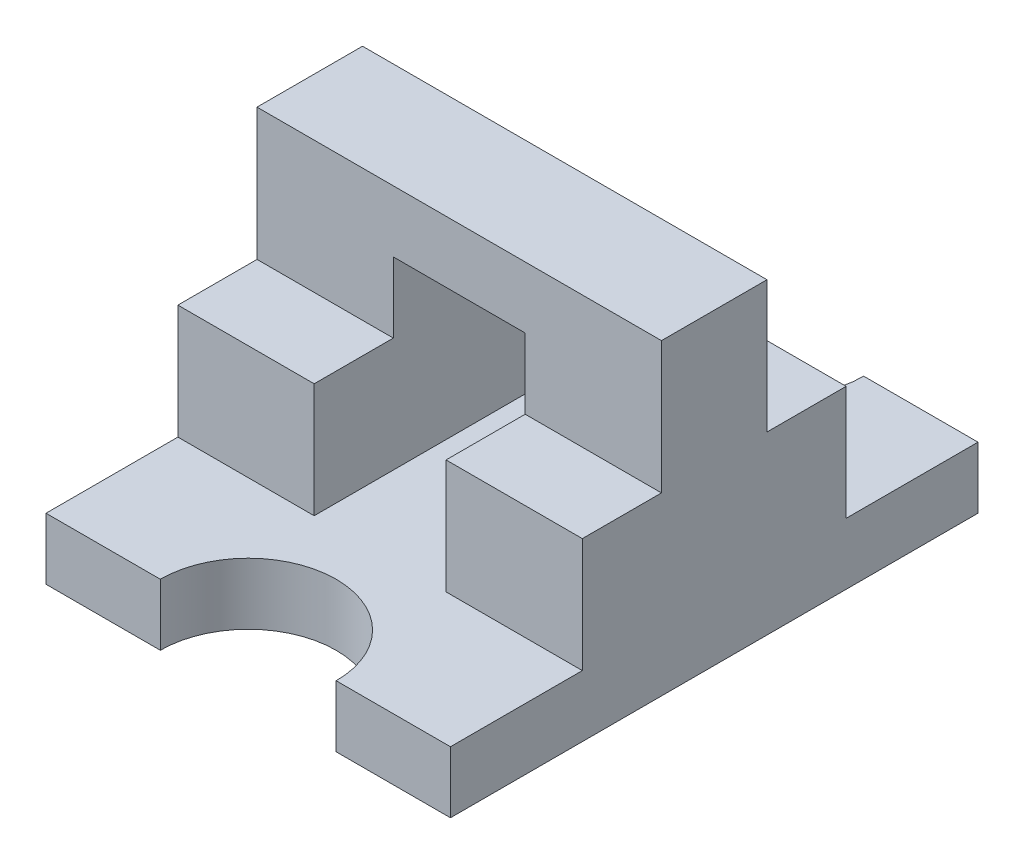
ISO-10303-21;
HEADER;
FILE_DESCRIPTION(('STEP AP214'),'2;1');
FILE_NAME('part.step','',(''),(''),'','','');
FILE_SCHEMA(('AUTOMOTIVE_DESIGN { 1 0 10303 214 1 1 1 1 }'));
ENDSEC;
DATA;
#1=APPLICATION_CONTEXT('core data for automotive mechanical design processes');
#2=APPLICATION_PROTOCOL_DEFINITION('international standard','automotive_design',2000,#1);
#3=PRODUCT_CONTEXT('',#1,'mechanical');
#4=PRODUCT('Part','Part','',(#3));
#5=PRODUCT_RELATED_PRODUCT_CATEGORY('part','',(#4));
#6=PRODUCT_DEFINITION_FORMATION('','',#4);
#7=PRODUCT_DEFINITION_CONTEXT('part definition',#1,'design');
#8=PRODUCT_DEFINITION('design','',#6,#7);
#9=PRODUCT_DEFINITION_SHAPE('','',#8);
#10=(LENGTH_UNIT() NAMED_UNIT(*) SI_UNIT(.MILLI.,.METRE.));
#11=(NAMED_UNIT(*) PLANE_ANGLE_UNIT() SI_UNIT($,.RADIAN.));
#12=(NAMED_UNIT(*) SI_UNIT($,.STERADIAN.) SOLID_ANGLE_UNIT());
#13=UNCERTAINTY_MEASURE_WITH_UNIT(LENGTH_MEASURE(1.E-05),#10,'distance_accuracy_value','');
#14=(GEOMETRIC_REPRESENTATION_CONTEXT(3) GLOBAL_UNCERTAINTY_ASSIGNED_CONTEXT((#13)) GLOBAL_UNIT_ASSIGNED_CONTEXT((#10,
#11,#12)) REPRESENTATION_CONTEXT('',''));
#15=CARTESIAN_POINT('',(0.,0.,0.));
#16=DIRECTION('',(0.,0.,1.));
#17=DIRECTION('',(1.,0.,0.));
#18=AXIS2_PLACEMENT_3D('',#15,#16,#17);
#19=CARTESIAN_POINT('',(46.,0.,-24.));
#20=DIRECTION('',(0.,0.,-1.));
#21=DIRECTION('',(0.,1.,0.));
#22=AXIS2_PLACEMENT_3D('',#19,#20,#21);
#23=PLANE('',#22);
#24=DIRECTION('',(0.,1.,0.));
#25=VECTOR('',#24,1.);
#26=CARTESIAN_POINT('',(30.5,0.,-24.));
#27=LINE('',#26,#25);
#28=CARTESIAN_POINT('',(30.5,20.,-24.));
#29=VERTEX_POINT('',#28);
#30=CARTESIAN_POINT('',(30.5,28.,-24.));
#31=VERTEX_POINT('',#30);
#32=EDGE_CURVE('E301',#29,#31,#27,.T.);
#33=ORIENTED_EDGE('',*,*,#32,.F.);
#34=DIRECTION('',(-1.,0.,0.));
#35=VECTOR('',#34,1.);
#36=CARTESIAN_POINT('',(46.,20.,-24.));
#37=LINE('',#36,#35);
#38=CARTESIAN_POINT('',(46.,20.,-24.));
#39=VERTEX_POINT('',#38);
#40=EDGE_CURVE('E271',#39,#29,#37,.T.);
#41=ORIENTED_EDGE('',*,*,#40,.F.);
#42=DIRECTION('',(0.,-1.,0.));
#43=VECTOR('',#42,1.);
#44=CARTESIAN_POINT('',(46.,0.,-24.));
#45=LINE('',#44,#43);
#46=CARTESIAN_POINT('',(46.,35.,-24.));
#47=VERTEX_POINT('',#46);
#48=EDGE_CURVE('E356',#47,#39,#45,.T.);
#49=ORIENTED_EDGE('',*,*,#48,.F.);
#50=DIRECTION('',(-1.,0.,0.));
#51=VECTOR('',#50,1.);
#52=CARTESIAN_POINT('',(46.,35.,-24.));
#53=LINE('',#52,#51);
#54=CARTESIAN_POINT('',(0.,35.,-24.));
#55=VERTEX_POINT('',#54);
#56=EDGE_CURVE('E394',#47,#55,#53,.T.);
#57=ORIENTED_EDGE('',*,*,#56,.T.);
#58=DIRECTION('',(0.,-1.,0.));
#59=VECTOR('',#58,1.);
#60=CARTESIAN_POINT('',(0.,0.,-24.));
#61=LINE('',#60,#59);
#62=CARTESIAN_POINT('',(0.,20.,-24.));
#63=VERTEX_POINT('',#62);
#64=EDGE_CURVE('E355',#55,#63,#61,.T.);
#65=ORIENTED_EDGE('',*,*,#64,.T.);
#66=CARTESIAN_POINT('',(15.5,20.,-24.));
#67=VERTEX_POINT('',#66);
#68=EDGE_CURVE('E270',#67,#63,#37,.T.);
#69=ORIENTED_EDGE('',*,*,#68,.F.);
#70=DIRECTION('',(0.,-1.,0.));
#71=VECTOR('',#70,1.);
#72=CARTESIAN_POINT('',(15.5,0.,-24.));
#73=LINE('',#72,#71);
#74=CARTESIAN_POINT('',(15.5,28.,-24.));
#75=VERTEX_POINT('',#74);
#76=EDGE_CURVE('E318',#75,#67,#73,.T.);
#77=ORIENTED_EDGE('',*,*,#76,.F.);
#78=DIRECTION('',(-1.,0.,0.));
#79=VECTOR('',#78,1.);
#80=CARTESIAN_POINT('',(46.,28.,-24.));
#81=LINE('',#80,#79);
#82=EDGE_CURVE('E309',#31,#75,#81,.T.);
#83=ORIENTED_EDGE('',*,*,#82,.F.);
#84=EDGE_LOOP('',(#33,#41,#49,#57,#65,#69,#77,#83));
#85=FACE_BOUND('',#84,.T.);
#86=ADVANCED_FACE('F45',(#85),#23,.F.);
#87=CARTESIAN_POINT('',(46.,20.,0.));
#88=DIRECTION('',(0.,-1.,0.));
#89=DIRECTION('',(0.,0.,-1.));
#90=AXIS2_PLACEMENT_3D('',#87,#88,#89);
#91=PLANE('',#90);
#92=DIRECTION('',(0.,0.,-1.));
#93=VECTOR('',#92,1.);
#94=CARTESIAN_POINT('',(30.5,20.,0.));
#95=LINE('',#94,#93);
#96=CARTESIAN_POINT('',(30.5,20.,-15.));
#97=VERTEX_POINT('',#96);
#98=EDGE_CURVE('E330',#97,#29,#95,.T.);
#99=ORIENTED_EDGE('',*,*,#98,.F.);
#100=DIRECTION('',(-1.,0.,0.));
#101=VECTOR('',#100,1.);
#102=CARTESIAN_POINT('',(46.,20.,-15.));
#103=LINE('',#102,#101);
#104=CARTESIAN_POINT('',(46.,20.,-15.));
#105=VERTEX_POINT('',#104);
#106=EDGE_CURVE('E266',#105,#97,#103,.T.);
#107=ORIENTED_EDGE('',*,*,#106,.F.);
#108=DIRECTION('',(0.,0.,1.));
#109=VECTOR('',#108,1.);
#110=CARTESIAN_POINT('',(46.,20.,0.));
#111=LINE('',#110,#109);
#112=EDGE_CURVE('E360',#39,#105,#111,.T.);
#113=ORIENTED_EDGE('',*,*,#112,.F.);
#114=ORIENTED_EDGE('',*,*,#40,.T.);
#115=EDGE_LOOP('',(#99,#107,#113,#114));
#116=FACE_BOUND('',#115,.T.);
#117=ADVANCED_FACE('F489',(#116),#91,.F.);
#118=DIRECTION('',(0.,0.,1.));
#119=VECTOR('',#118,1.);
#120=CARTESIAN_POINT('',(15.5,20.,0.));
#121=LINE('',#120,#119);
#122=CARTESIAN_POINT('',(15.5,20.,-15.));
#123=VERTEX_POINT('',#122);
#124=EDGE_CURVE('E60',#67,#123,#121,.T.);
#125=ORIENTED_EDGE('',*,*,#124,.F.);
#126=ORIENTED_EDGE('',*,*,#68,.T.);
#127=DIRECTION('',(0.,0.,1.));
#128=VECTOR('',#127,1.);
#129=CARTESIAN_POINT('',(0.,20.,0.));
#130=LINE('',#129,#128);
#131=CARTESIAN_POINT('',(0.,20.,-15.));
#132=VERTEX_POINT('',#131);
#133=EDGE_CURVE('E398',#63,#132,#130,.T.);
#134=ORIENTED_EDGE('',*,*,#133,.T.);
#135=EDGE_CURVE('E265',#123,#132,#103,.T.);
#136=ORIENTED_EDGE('',*,*,#135,.F.);
#137=EDGE_LOOP('',(#125,#126,#134,#136));
#138=FACE_BOUND('',#137,.T.);
#139=ADVANCED_FACE('F492',(#138),#91,.F.);
#140=CARTESIAN_POINT('',(46.,0.,-15.));
#141=DIRECTION('',(0.,0.,-1.));
#142=DIRECTION('',(-1.,0.,0.));
#143=AXIS2_PLACEMENT_3D('',#140,#141,#142);
#144=PLANE('',#143);
#145=DIRECTION('',(0.,1.,0.));
#146=VECTOR('',#145,1.);
#147=CARTESIAN_POINT('',(30.5,0.,-15.));
#148=LINE('',#147,#146);
#149=CARTESIAN_POINT('',(30.5,7.,-15.));
#150=VERTEX_POINT('',#149);
#151=EDGE_CURVE('E327',#150,#97,#148,.T.);
#152=ORIENTED_EDGE('',*,*,#151,.F.);
#153=DIRECTION('',(-1.,0.,0.));
#154=VECTOR('',#153,1.);
#155=CARTESIAN_POINT('',(46.,7.,-15.));
#156=LINE('',#155,#154);
#157=CARTESIAN_POINT('',(46.,7.,-15.));
#158=VERTEX_POINT('',#157);
#159=EDGE_CURVE('E261',#158,#150,#156,.T.);
#160=ORIENTED_EDGE('',*,*,#159,.F.);
#161=DIRECTION('',(0.,-1.,0.));
#162=VECTOR('',#161,1.);
#163=CARTESIAN_POINT('',(46.,0.,-15.));
#164=LINE('',#163,#162);
#165=EDGE_CURVE('E364',#105,#158,#164,.T.);
#166=ORIENTED_EDGE('',*,*,#165,.F.);
#167=ORIENTED_EDGE('',*,*,#106,.T.);
#168=EDGE_LOOP('',(#152,#160,#166,#167));
#169=FACE_BOUND('',#168,.T.);
#170=ADVANCED_FACE('F486',(#169),#144,.F.);
#171=DIRECTION('',(0.,-1.,0.));
#172=VECTOR('',#171,1.);
#173=CARTESIAN_POINT('',(15.5,0.,-15.));
#174=LINE('',#173,#172);
#175=CARTESIAN_POINT('',(15.5,7.,-15.));
#176=VERTEX_POINT('',#175);
#177=EDGE_CURVE('E208',#123,#176,#174,.T.);
#178=ORIENTED_EDGE('',*,*,#177,.F.);
#179=ORIENTED_EDGE('',*,*,#135,.T.);
#180=DIRECTION('',(0.,-1.,0.));
#181=VECTOR('',#180,1.);
#182=CARTESIAN_POINT('',(0.,0.,-15.));
#183=LINE('',#182,#181);
#184=CARTESIAN_POINT('',(0.,7.,-15.));
#185=VERTEX_POINT('',#184);
#186=EDGE_CURVE('E402',#132,#185,#183,.T.);
#187=ORIENTED_EDGE('',*,*,#186,.T.);
#188=EDGE_CURVE('E260',#176,#185,#156,.T.);
#189=ORIENTED_EDGE('',*,*,#188,.F.);
#190=EDGE_LOOP('',(#178,#179,#187,#189));
#191=FACE_BOUND('',#190,.T.);
#192=ADVANCED_FACE('F521',(#191),#144,.F.);
#193=CARTESIAN_POINT('',(46.,0.,-45.));
#194=DIRECTION('',(0.,0.,1.));
#195=DIRECTION('',(1.,0.,0.));
#196=AXIS2_PLACEMENT_3D('',#193,#194,#195);
#197=PLANE('',#196);
#198=DIRECTION('',(0.,-1.,0.));
#199=VECTOR('',#198,1.);
#200=CARTESIAN_POINT('',(30.5,0.,-45.));
#201=LINE('',#200,#199);
#202=CARTESIAN_POINT('',(30.5,20.,-45.));
#203=VERTEX_POINT('',#202);
#204=CARTESIAN_POINT('',(30.5,7.,-45.));
#205=VERTEX_POINT('',#204);
#206=EDGE_CURVE('E324',#203,#205,#201,.T.);
#207=ORIENTED_EDGE('',*,*,#206,.F.);
#208=DIRECTION('',(-1.,0.,0.));
#209=VECTOR('',#208,1.);
#210=CARTESIAN_POINT('',(46.,20.,-45.));
#211=LINE('',#210,#209);
#212=CARTESIAN_POINT('',(46.,20.,-45.));
#213=VERTEX_POINT('',#212);
#214=EDGE_CURVE('E232',#213,#203,#211,.T.);
#215=ORIENTED_EDGE('',*,*,#214,.F.);
#216=DIRECTION('',(0.,1.,0.));
#217=VECTOR('',#216,1.);
#218=CARTESIAN_POINT('',(46.,0.,-45.));
#219=LINE('',#218,#217);
#220=CARTESIAN_POINT('',(46.,7.,-45.));
#221=VERTEX_POINT('',#220);
#222=EDGE_CURVE('E382',#221,#213,#219,.T.);
#223=ORIENTED_EDGE('',*,*,#222,.F.);
#224=DIRECTION('',(-1.,0.,0.));
#225=VECTOR('',#224,1.);
#226=CARTESIAN_POINT('',(46.,7.,-45.));
#227=LINE('',#226,#225);
#228=EDGE_CURVE('E231',#221,#205,#227,.T.);
#229=ORIENTED_EDGE('',*,*,#228,.T.);
#230=EDGE_LOOP('',(#207,#215,#223,#229));
#231=FACE_BOUND('',#230,.T.);
#232=ADVANCED_FACE('F478',(#231),#197,.F.);
#233=DIRECTION('',(0.,1.,0.));
#234=VECTOR('',#233,1.);
#235=CARTESIAN_POINT('',(15.5,0.,-45.));
#236=LINE('',#235,#234);
#237=CARTESIAN_POINT('',(15.5,7.,-45.));
#238=VERTEX_POINT('',#237);
#239=CARTESIAN_POINT('',(15.5,20.,-45.));
#240=VERTEX_POINT('',#239);
#241=EDGE_CURVE('E206',#238,#240,#236,.T.);
#242=ORIENTED_EDGE('',*,*,#241,.F.);
#243=CARTESIAN_POINT('',(0.,7.,-45.));
#244=VERTEX_POINT('',#243);
#245=EDGE_CURVE('E219',#238,#244,#227,.T.);
#246=ORIENTED_EDGE('',*,*,#245,.T.);
#247=DIRECTION('',(0.,1.,0.));
#248=VECTOR('',#247,1.);
#249=CARTESIAN_POINT('',(0.,0.,-45.));
#250=LINE('',#249,#248);
#251=CARTESIAN_POINT('',(0.,20.,-45.));
#252=VERTEX_POINT('',#251);
#253=EDGE_CURVE('E424',#244,#252,#250,.T.);
#254=ORIENTED_EDGE('',*,*,#253,.T.);
#255=EDGE_CURVE('E221',#240,#252,#211,.T.);
#256=ORIENTED_EDGE('',*,*,#255,.F.);
#257=EDGE_LOOP('',(#242,#246,#254,#256));
#258=FACE_BOUND('',#257,.T.);
#259=ADVANCED_FACE('F217',(#258),#197,.F.);
#260=CARTESIAN_POINT('',(46.,20.,0.));
#261=DIRECTION('',(0.,-1.,0.));
#262=DIRECTION('',(0.,0.,-1.));
#263=AXIS2_PLACEMENT_3D('',#260,#261,#262);
#264=PLANE('',#263);
#265=DIRECTION('',(0.,0.,-1.));
#266=VECTOR('',#265,1.);
#267=CARTESIAN_POINT('',(30.5,20.,0.));
#268=LINE('',#267,#266);
#269=CARTESIAN_POINT('',(30.5,20.,-36.));
#270=VERTEX_POINT('',#269);
#271=EDGE_CURVE('E321',#270,#203,#268,.T.);
#272=ORIENTED_EDGE('',*,*,#271,.F.);
#273=DIRECTION('',(-1.,0.,0.));
#274=VECTOR('',#273,1.);
#275=CARTESIAN_POINT('',(46.,20.,-36.));
#276=LINE('',#275,#274);
#277=CARTESIAN_POINT('',(46.,20.,-36.));
#278=VERTEX_POINT('',#277);
#279=EDGE_CURVE('E443',#278,#270,#276,.T.);
#280=ORIENTED_EDGE('',*,*,#279,.F.);
#281=DIRECTION('',(0.,0.,1.));
#282=VECTOR('',#281,1.);
#283=CARTESIAN_POINT('',(46.,20.,0.));
#284=LINE('',#283,#282);
#285=EDGE_CURVE('E385',#213,#278,#284,.T.);
#286=ORIENTED_EDGE('',*,*,#285,.F.);
#287=ORIENTED_EDGE('',*,*,#214,.T.);
#288=EDGE_LOOP('',(#272,#280,#286,#287));
#289=FACE_BOUND('',#288,.T.);
#290=ADVANCED_FACE('F474',(#289),#264,.F.);
#291=DIRECTION('',(0.,0.,1.));
#292=VECTOR('',#291,1.);
#293=CARTESIAN_POINT('',(15.5,20.,0.));
#294=LINE('',#293,#292);
#295=CARTESIAN_POINT('',(15.5,20.,-36.));
#296=VERTEX_POINT('',#295);
#297=EDGE_CURVE('E223',#240,#296,#294,.T.);
#298=ORIENTED_EDGE('',*,*,#297,.F.);
#299=ORIENTED_EDGE('',*,*,#255,.T.);
#300=DIRECTION('',(0.,0.,1.));
#301=VECTOR('',#300,1.);
#302=CARTESIAN_POINT('',(0.,20.,0.));
#303=LINE('',#302,#301);
#304=CARTESIAN_POINT('',(0.,20.,-36.));
#305=VERTEX_POINT('',#304);
#306=EDGE_CURVE('E427',#252,#305,#303,.T.);
#307=ORIENTED_EDGE('',*,*,#306,.T.);
#308=EDGE_CURVE('E442',#296,#305,#276,.T.);
#309=ORIENTED_EDGE('',*,*,#308,.F.);
#310=EDGE_LOOP('',(#298,#299,#307,#309));
#311=FACE_BOUND('',#310,.T.);
#312=ADVANCED_FACE('F453',(#311),#264,.F.);
#313=CARTESIAN_POINT('',(46.,0.,-36.));
#314=DIRECTION('',(0.,0.,1.));
#315=DIRECTION('',(1.,0.,0.));
#316=AXIS2_PLACEMENT_3D('',#313,#314,#315);
#317=PLANE('',#316);
#318=DIRECTION('',(0.,-1.,0.));
#319=VECTOR('',#318,1.);
#320=CARTESIAN_POINT('',(30.5,0.,-36.));
#321=LINE('',#320,#319);
#322=CARTESIAN_POINT('',(30.5,28.,-36.));
#323=VERTEX_POINT('',#322);
#324=EDGE_CURVE('E11',#323,#270,#321,.T.);
#325=ORIENTED_EDGE('',*,*,#324,.F.);
#326=DIRECTION('',(1.,0.,0.));
#327=VECTOR('',#326,1.);
#328=CARTESIAN_POINT('',(46.,28.,-36.));
#329=LINE('',#328,#327);
#330=CARTESIAN_POINT('',(15.5,28.,-36.));
#331=VERTEX_POINT('',#330);
#332=EDGE_CURVE('E281',#331,#323,#329,.T.);
#333=ORIENTED_EDGE('',*,*,#332,.F.);
#334=DIRECTION('',(0.,1.,0.));
#335=VECTOR('',#334,1.);
#336=CARTESIAN_POINT('',(15.5,0.,-36.));
#337=LINE('',#336,#335);
#338=EDGE_CURVE('E53',#296,#331,#337,.T.);
#339=ORIENTED_EDGE('',*,*,#338,.F.);
#340=ORIENTED_EDGE('',*,*,#308,.T.);
#341=DIRECTION('',(0.,1.,0.));
#342=VECTOR('',#341,1.);
#343=CARTESIAN_POINT('',(0.,0.,-36.));
#344=LINE('',#343,#342);
#345=CARTESIAN_POINT('',(0.,35.,-36.));
#346=VERTEX_POINT('',#345);
#347=EDGE_CURVE('E431',#305,#346,#344,.T.);
#348=ORIENTED_EDGE('',*,*,#347,.T.);
#349=DIRECTION('',(-1.,0.,0.));
#350=VECTOR('',#349,1.);
#351=CARTESIAN_POINT('',(46.,35.,-36.));
#352=LINE('',#351,#350);
#353=CARTESIAN_POINT('',(46.,35.,-36.));
#354=VERTEX_POINT('',#353);
#355=EDGE_CURVE('E439',#354,#346,#352,.T.);
#356=ORIENTED_EDGE('',*,*,#355,.F.);
#357=DIRECTION('',(0.,1.,0.));
#358=VECTOR('',#357,1.);
#359=CARTESIAN_POINT('',(46.,0.,-36.));
#360=LINE('',#359,#358);
#361=EDGE_CURVE('E388',#278,#354,#360,.T.);
#362=ORIENTED_EDGE('',*,*,#361,.F.);
#363=ORIENTED_EDGE('',*,*,#279,.T.);
#364=EDGE_LOOP('',(#325,#333,#339,#340,#348,#356,#362,#363));
#365=FACE_BOUND('',#364,.T.);
#366=ADVANCED_FACE('F290',(#365),#317,.F.);
#367=CARTESIAN_POINT('',(46.,0.,0.));
#368=DIRECTION('',(0.,0.,-1.));
#369=DIRECTION('',(0.,1.,0.));
#370=AXIS2_PLACEMENT_3D('',#367,#368,#369);
#371=PLANE('',#370);
#372=DIRECTION('',(0.,-1.,0.));
#373=VECTOR('',#372,1.);
#374=CARTESIAN_POINT('',(33.,46.,0.));
#375=LINE('',#374,#373);
#376=CARTESIAN_POINT('',(33.,7.,0.));
#377=VERTEX_POINT('',#376);
#378=CARTESIAN_POINT('',(33.,0.,0.));
#379=VERTEX_POINT('',#378);
#380=EDGE_CURVE('E339',#377,#379,#375,.T.);
#381=ORIENTED_EDGE('',*,*,#380,.T.);
#382=DIRECTION('',(-1.,0.,0.));
#383=VECTOR('',#382,1.);
#384=CARTESIAN_POINT('',(46.,0.,0.));
#385=LINE('',#384,#383);
#386=CARTESIAN_POINT('',(46.,0.,0.));
#387=VERTEX_POINT('',#386);
#388=EDGE_CURVE('E251',#387,#379,#385,.T.);
#389=ORIENTED_EDGE('',*,*,#388,.F.);
#390=DIRECTION('',(0.,-1.,0.));
#391=VECTOR('',#390,1.);
#392=CARTESIAN_POINT('',(46.,0.,0.));
#393=LINE('',#392,#391);
#394=CARTESIAN_POINT('',(46.,7.,0.));
#395=VERTEX_POINT('',#394);
#396=EDGE_CURVE('E370',#395,#387,#393,.T.);
#397=ORIENTED_EDGE('',*,*,#396,.F.);
#398=DIRECTION('',(-1.,0.,0.));
#399=VECTOR('',#398,1.);
#400=CARTESIAN_POINT('',(46.,7.,0.));
#401=LINE('',#400,#399);
#402=EDGE_CURVE('E256',#395,#377,#401,.T.);
#403=ORIENTED_EDGE('',*,*,#402,.T.);
#404=EDGE_LOOP('',(#381,#389,#397,#403));
#405=FACE_BOUND('',#404,.T.);
#406=ADVANCED_FACE('F584',(#405),#371,.F.);
#407=DIRECTION('',(0.,-1.,0.));
#408=VECTOR('',#407,1.);
#409=CARTESIAN_POINT('',(13.,46.,0.));
#410=LINE('',#409,#408);
#411=CARTESIAN_POINT('',(13.,7.,0.));
#412=VERTEX_POINT('',#411);
#413=CARTESIAN_POINT('',(13.,0.,0.));
#414=VERTEX_POINT('',#413);
#415=EDGE_CURVE('E336',#412,#414,#410,.T.);
#416=ORIENTED_EDGE('',*,*,#415,.F.);
#417=CARTESIAN_POINT('',(0.,7.,0.));
#418=VERTEX_POINT('',#417);
#419=EDGE_CURVE('E255',#412,#418,#401,.T.);
#420=ORIENTED_EDGE('',*,*,#419,.T.);
#421=DIRECTION('',(0.,-1.,0.));
#422=VECTOR('',#421,1.);
#423=CARTESIAN_POINT('',(0.,0.,0.));
#424=LINE('',#423,#422);
#425=CARTESIAN_POINT('',(0.,0.,0.));
#426=VERTEX_POINT('',#425);
#427=EDGE_CURVE('E410',#418,#426,#424,.T.);
#428=ORIENTED_EDGE('',*,*,#427,.T.);
#429=EDGE_CURVE('E250',#414,#426,#385,.T.);
#430=ORIENTED_EDGE('',*,*,#429,.F.);
#431=EDGE_LOOP('',(#416,#420,#428,#430));
#432=FACE_BOUND('',#431,.T.);
#433=ADVANCED_FACE('F518',(#432),#371,.F.);
#434=CARTESIAN_POINT('',(46.,0.,-60.));
#435=DIRECTION('',(0.,0.,1.));
#436=DIRECTION('',(1.,0.,0.));
#437=AXIS2_PLACEMENT_3D('',#434,#435,#436);
#438=PLANE('',#437);
#439=DIRECTION('',(0.,-1.,0.));
#440=VECTOR('',#439,1.);
#441=CARTESIAN_POINT('',(13.,46.,-60.));
#442=LINE('',#441,#440);
#443=CARTESIAN_POINT('',(13.,7.00000000000001,-60.));
#444=VERTEX_POINT('',#443);
#445=CARTESIAN_POINT('',(13.,0.,-60.));
#446=VERTEX_POINT('',#445);
#447=EDGE_CURVE('E340',#444,#446,#442,.T.);
#448=ORIENTED_EDGE('',*,*,#447,.T.);
#449=DIRECTION('',(-1.,0.,0.));
#450=VECTOR('',#449,1.);
#451=CARTESIAN_POINT('',(46.,0.,-60.));
#452=LINE('',#451,#450);
#453=CARTESIAN_POINT('',(0.,0.,-60.));
#454=VERTEX_POINT('',#453);
#455=EDGE_CURVE('E245',#446,#454,#452,.T.);
#456=ORIENTED_EDGE('',*,*,#455,.T.);
#457=DIRECTION('',(0.,1.,0.));
#458=VECTOR('',#457,1.);
#459=CARTESIAN_POINT('',(0.,0.,-60.));
#460=LINE('',#459,#458);
#461=CARTESIAN_POINT('',(0.,7.,-60.));
#462=VERTEX_POINT('',#461);
#463=EDGE_CURVE('E418',#454,#462,#460,.T.);
#464=ORIENTED_EDGE('',*,*,#463,.T.);
#465=DIRECTION('',(-1.,0.,0.));
#466=VECTOR('',#465,1.);
#467=CARTESIAN_POINT('',(46.,7.,-60.));
#468=LINE('',#467,#466);
#469=EDGE_CURVE('E237',#444,#462,#468,.T.);
#470=ORIENTED_EDGE('',*,*,#469,.F.);
#471=EDGE_LOOP('',(#448,#456,#464,#470));
#472=FACE_BOUND('',#471,.T.);
#473=ADVANCED_FACE('F506',(#472),#438,.F.);
#474=DIRECTION('',(0.,-1.,0.));
#475=VECTOR('',#474,1.);
#476=CARTESIAN_POINT('',(33.,46.,-60.));
#477=LINE('',#476,#475);
#478=CARTESIAN_POINT('',(33.,7.00000000000001,-60.));
#479=VERTEX_POINT('',#478);
#480=CARTESIAN_POINT('',(33.,0.,-60.));
#481=VERTEX_POINT('',#480);
#482=EDGE_CURVE('E335',#479,#481,#477,.T.);
#483=ORIENTED_EDGE('',*,*,#482,.F.);
#484=CARTESIAN_POINT('',(46.,7.,-60.));
#485=VERTEX_POINT('',#484);
#486=EDGE_CURVE('E242',#485,#479,#468,.T.);
#487=ORIENTED_EDGE('',*,*,#486,.F.);
#488=DIRECTION('',(0.,1.,0.));
#489=VECTOR('',#488,1.);
#490=CARTESIAN_POINT('',(46.,0.,-60.));
#491=LINE('',#490,#489);
#492=CARTESIAN_POINT('',(46.,0.,-60.));
#493=VERTEX_POINT('',#492);
#494=EDGE_CURVE('E376',#493,#485,#491,.T.);
#495=ORIENTED_EDGE('',*,*,#494,.F.);
#496=EDGE_CURVE('E246',#493,#481,#452,.T.);
#497=ORIENTED_EDGE('',*,*,#496,.T.);
#498=EDGE_LOOP('',(#483,#487,#495,#497));
#499=FACE_BOUND('',#498,.T.);
#500=ADVANCED_FACE('F688',(#499),#438,.F.);
#501=CARTESIAN_POINT('',(46.,0.,0.));
#502=DIRECTION('',(0.,1.,0.));
#503=DIRECTION('',(0.,0.,1.));
#504=AXIS2_PLACEMENT_3D('',#501,#502,#503);
#505=PLANE('',#504);
#506=CARTESIAN_POINT('',(23.,0.,0.));
#507=DIRECTION('',(0.,1.,0.));
#508=DIRECTION('',(0.,0.,1.));
#509=AXIS2_PLACEMENT_3D('',#506,#507,#508);
#510=CIRCLE('',#509,10.);
#511=EDGE_CURVE('E278',#414,#379,#510,.F.);
#512=ORIENTED_EDGE('',*,*,#511,.F.);
#513=ORIENTED_EDGE('',*,*,#429,.T.);
#514=DIRECTION('',(0.,0.,-1.));
#515=VECTOR('',#514,1.);
#516=CARTESIAN_POINT('',(0.,0.,0.));
#517=LINE('',#516,#515);
#518=EDGE_CURVE('E414',#426,#454,#517,.T.);
#519=ORIENTED_EDGE('',*,*,#518,.T.);
#520=ORIENTED_EDGE('',*,*,#455,.F.);
#521=CARTESIAN_POINT('',(23.,0.,-60.));
#522=DIRECTION('',(0.,1.,0.));
#523=DIRECTION('',(0.,0.,1.));
#524=AXIS2_PLACEMENT_3D('',#521,#522,#523);
#525=CIRCLE('',#524,10.);
#526=EDGE_CURVE('E344',#481,#446,#525,.F.);
#527=ORIENTED_EDGE('',*,*,#526,.F.);
#528=ORIENTED_EDGE('',*,*,#496,.F.);
#529=DIRECTION('',(0.,0.,-1.));
#530=VECTOR('',#529,1.);
#531=CARTESIAN_POINT('',(46.,0.,0.));
#532=LINE('',#531,#530);
#533=EDGE_CURVE('E373',#387,#493,#532,.T.);
#534=ORIENTED_EDGE('',*,*,#533,.F.);
#535=ORIENTED_EDGE('',*,*,#388,.T.);
#536=EDGE_LOOP('',(#512,#513,#519,#520,#527,#528,#534,#535));
#537=FACE_BOUND('',#536,.T.);
#538=ADVANCED_FACE('F513',(#537),#505,.F.);
#539=CARTESIAN_POINT('',(46.,6.99999999999999,0.));
#540=DIRECTION('',(0.,-1.,0.));
#541=DIRECTION('',(0.,0.,-1.));
#542=AXIS2_PLACEMENT_3D('',#539,#540,#541);
#543=PLANE('',#542);
#544=ORIENTED_EDGE('',*,*,#486,.T.);
#545=CARTESIAN_POINT('',(23.,7.00000000000001,-60.));
#546=DIRECTION('',(0.,-1.,0.));
#547=DIRECTION('',(0.,0.,-1.));
#548=AXIS2_PLACEMENT_3D('',#545,#546,#547);
#549=CIRCLE('',#548,10.);
#550=EDGE_CURVE('E275',#444,#479,#549,.F.);
#551=ORIENTED_EDGE('',*,*,#550,.F.);
#552=ORIENTED_EDGE('',*,*,#469,.T.);
#553=DIRECTION('',(0.,0.,1.));
#554=VECTOR('',#553,1.);
#555=CARTESIAN_POINT('',(0.,6.99999999999999,0.));
#556=LINE('',#555,#554);
#557=EDGE_CURVE('E228',#462,#244,#556,.T.);
#558=ORIENTED_EDGE('',*,*,#557,.T.);
#559=ORIENTED_EDGE('',*,*,#245,.F.);
#560=DIRECTION('',(0.,0.,1.));
#561=VECTOR('',#560,1.);
#562=CARTESIAN_POINT('',(15.5,7.,-60.));
#563=LINE('',#562,#561);
#564=EDGE_CURVE('E203',#238,#176,#563,.T.);
#565=ORIENTED_EDGE('',*,*,#564,.T.);
#566=ORIENTED_EDGE('',*,*,#188,.T.);
#567=DIRECTION('',(0.,0.,1.));
#568=VECTOR('',#567,1.);
#569=CARTESIAN_POINT('',(0.,7.,0.));
#570=LINE('',#569,#568);
#571=EDGE_CURVE('E406',#185,#418,#570,.T.);
#572=ORIENTED_EDGE('',*,*,#571,.T.);
#573=ORIENTED_EDGE('',*,*,#419,.F.);
#574=CARTESIAN_POINT('',(23.,7.,0.));
#575=DIRECTION('',(0.,-1.,0.));
#576=DIRECTION('',(0.,0.,-1.));
#577=AXIS2_PLACEMENT_3D('',#574,#575,#576);
#578=CIRCLE('',#577,10.);
#579=EDGE_CURVE('E352',#377,#412,#578,.F.);
#580=ORIENTED_EDGE('',*,*,#579,.F.);
#581=ORIENTED_EDGE('',*,*,#402,.F.);
#582=DIRECTION('',(0.,0.,1.));
#583=VECTOR('',#582,1.);
#584=CARTESIAN_POINT('',(46.,7.,0.));
#585=LINE('',#584,#583);
#586=EDGE_CURVE('E367',#158,#395,#585,.T.);
#587=ORIENTED_EDGE('',*,*,#586,.F.);
#588=ORIENTED_EDGE('',*,*,#159,.T.);
#589=DIRECTION('',(0.,0.,1.));
#590=VECTOR('',#589,1.);
#591=CARTESIAN_POINT('',(30.5,7.,-60.));
#592=LINE('',#591,#590);
#593=EDGE_CURVE('E213',#205,#150,#592,.T.);
#594=ORIENTED_EDGE('',*,*,#593,.F.);
#595=ORIENTED_EDGE('',*,*,#228,.F.);
#596=DIRECTION('',(0.,0.,1.));
#597=VECTOR('',#596,1.);
#598=CARTESIAN_POINT('',(46.,6.99999999999999,0.));
#599=LINE('',#598,#597);
#600=EDGE_CURVE('E379',#485,#221,#599,.T.);
#601=ORIENTED_EDGE('',*,*,#600,.F.);
#602=EDGE_LOOP('',(#544,#551,#552,#558,#559,#565,#566,#572,#573,#580,#581,#587,#588,#594,#595,#601));
#603=FACE_BOUND('',#602,.T.);
#604=ADVANCED_FACE('F226',(#603),#543,.F.);
#605=CARTESIAN_POINT('',(46.,35.,0.));
#606=DIRECTION('',(0.,-1.,0.));
#607=DIRECTION('',(0.,0.,-1.));
#608=AXIS2_PLACEMENT_3D('',#605,#606,#607);
#609=PLANE('',#608);
#610=DIRECTION('',(0.,0.,1.));
#611=VECTOR('',#610,1.);
#612=CARTESIAN_POINT('',(0.,35.,0.));
#613=LINE('',#612,#611);
#614=EDGE_CURVE('E361',#346,#55,#613,.T.);
#615=ORIENTED_EDGE('',*,*,#614,.T.);
#616=ORIENTED_EDGE('',*,*,#56,.F.);
#617=DIRECTION('',(0.,0.,1.));
#618=VECTOR('',#617,1.);
#619=CARTESIAN_POINT('',(46.,35.,0.));
#620=LINE('',#619,#618);
#621=EDGE_CURVE('E391',#354,#47,#620,.T.);
#622=ORIENTED_EDGE('',*,*,#621,.F.);
#623=ORIENTED_EDGE('',*,*,#355,.T.);
#624=EDGE_LOOP('',(#615,#616,#622,#623));
#625=FACE_BOUND('',#624,.T.);
#626=ADVANCED_FACE('F461',(#625),#609,.F.);
#627=CARTESIAN_POINT('',(46.,0.,0.));
#628=DIRECTION('',(1.,0.,0.));
#629=DIRECTION('',(0.,0.,-1.));
#630=AXIS2_PLACEMENT_3D('',#627,#628,#629);
#631=PLANE('',#630);
#632=ORIENTED_EDGE('',*,*,#48,.T.);
#633=ORIENTED_EDGE('',*,*,#112,.T.);
#634=ORIENTED_EDGE('',*,*,#165,.T.);
#635=ORIENTED_EDGE('',*,*,#586,.T.);
#636=ORIENTED_EDGE('',*,*,#396,.T.);
#637=ORIENTED_EDGE('',*,*,#533,.T.);
#638=ORIENTED_EDGE('',*,*,#494,.T.);
#639=ORIENTED_EDGE('',*,*,#600,.T.);
#640=ORIENTED_EDGE('',*,*,#222,.T.);
#641=ORIENTED_EDGE('',*,*,#285,.T.);
#642=ORIENTED_EDGE('',*,*,#361,.T.);
#643=ORIENTED_EDGE('',*,*,#621,.T.);
#644=EDGE_LOOP('',(#632,#633,#634,#635,#636,#637,#638,#639,#640,#641,#642,#643));
#645=FACE_BOUND('',#644,.T.);
#646=ADVANCED_FACE('F468',(#645),#631,.T.);
#647=CARTESIAN_POINT('',(0.,0.,0.));
#648=DIRECTION('',(1.,0.,0.));
#649=DIRECTION('',(0.,0.,-1.));
#650=AXIS2_PLACEMENT_3D('',#647,#648,#649);
#651=PLANE('',#650);
#652=ORIENTED_EDGE('',*,*,#64,.F.);
#653=ORIENTED_EDGE('',*,*,#614,.F.);
#654=ORIENTED_EDGE('',*,*,#347,.F.);
#655=ORIENTED_EDGE('',*,*,#306,.F.);
#656=ORIENTED_EDGE('',*,*,#253,.F.);
#657=ORIENTED_EDGE('',*,*,#557,.F.);
#658=ORIENTED_EDGE('',*,*,#463,.F.);
#659=ORIENTED_EDGE('',*,*,#518,.F.);
#660=ORIENTED_EDGE('',*,*,#427,.F.);
#661=ORIENTED_EDGE('',*,*,#571,.F.);
#662=ORIENTED_EDGE('',*,*,#186,.F.);
#663=ORIENTED_EDGE('',*,*,#133,.F.);
#664=EDGE_LOOP('',(#652,#653,#654,#655,#656,#657,#658,#659,#660,#661,#662,#663));
#665=FACE_BOUND('',#664,.T.);
#666=ADVANCED_FACE('F457',(#665),#651,.F.);
#667=CARTESIAN_POINT('',(23.,46.,-60.));
#668=DIRECTION('',(0.,-1.,0.));
#669=DIRECTION('',(0.,0.,-1.));
#670=AXIS2_PLACEMENT_3D('',#667,#668,#669);
#671=CYLINDRICAL_SURFACE('',#670,10.);
#672=ORIENTED_EDGE('',*,*,#526,.T.);
#673=ORIENTED_EDGE('',*,*,#447,.F.);
#674=ORIENTED_EDGE('',*,*,#550,.T.);
#675=ORIENTED_EDGE('',*,*,#482,.T.);
#676=EDGE_LOOP('',(#672,#673,#674,#675));
#677=FACE_BOUND('',#676,.T.);
#678=ADVANCED_FACE('F603',(#677),#671,.F.);
#679=CARTESIAN_POINT('',(23.,46.,0.));
#680=DIRECTION('',(0.,-1.,0.));
#681=DIRECTION('',(0.,0.,-1.));
#682=AXIS2_PLACEMENT_3D('',#679,#680,#681);
#683=CYLINDRICAL_SURFACE('',#682,10.);
#684=ORIENTED_EDGE('',*,*,#579,.T.);
#685=ORIENTED_EDGE('',*,*,#415,.T.);
#686=ORIENTED_EDGE('',*,*,#511,.T.);
#687=ORIENTED_EDGE('',*,*,#380,.F.);
#688=EDGE_LOOP('',(#684,#685,#686,#687));
#689=FACE_BOUND('',#688,.T.);
#690=ADVANCED_FACE('F608',(#689),#683,.F.);
#691=CARTESIAN_POINT('',(30.5,28.,-60.));
#692=DIRECTION('',(-1.,0.,0.));
#693=DIRECTION('',(0.,0.,1.));
#694=AXIS2_PLACEMENT_3D('',#691,#692,#693);
#695=PLANE('',#694);
#696=ORIENTED_EDGE('',*,*,#32,.T.);
#697=DIRECTION('',(0.,0.,1.));
#698=VECTOR('',#697,1.);
#699=CARTESIAN_POINT('',(30.5,28.,-60.));
#700=LINE('',#699,#698);
#701=EDGE_CURVE('E295',#323,#31,#700,.T.);
#702=ORIENTED_EDGE('',*,*,#701,.F.);
#703=ORIENTED_EDGE('',*,*,#324,.T.);
#704=ORIENTED_EDGE('',*,*,#271,.T.);
#705=ORIENTED_EDGE('',*,*,#206,.T.);
#706=ORIENTED_EDGE('',*,*,#593,.T.);
#707=ORIENTED_EDGE('',*,*,#151,.T.);
#708=ORIENTED_EDGE('',*,*,#98,.T.);
#709=EDGE_LOOP('',(#696,#702,#703,#704,#705,#706,#707,#708));
#710=FACE_BOUND('',#709,.T.);
#711=ADVANCED_FACE('F298',(#710),#695,.T.);
#712=CARTESIAN_POINT('',(15.5,7.,-60.));
#713=DIRECTION('',(1.,0.,0.));
#714=DIRECTION('',(0.,0.,-1.));
#715=AXIS2_PLACEMENT_3D('',#712,#713,#714);
#716=PLANE('',#715);
#717=ORIENTED_EDGE('',*,*,#76,.T.);
#718=ORIENTED_EDGE('',*,*,#124,.T.);
#719=ORIENTED_EDGE('',*,*,#177,.T.);
#720=ORIENTED_EDGE('',*,*,#564,.F.);
#721=ORIENTED_EDGE('',*,*,#241,.T.);
#722=ORIENTED_EDGE('',*,*,#297,.T.);
#723=ORIENTED_EDGE('',*,*,#338,.T.);
#724=DIRECTION('',(0.,0.,1.));
#725=VECTOR('',#724,1.);
#726=CARTESIAN_POINT('',(15.5,28.,-60.));
#727=LINE('',#726,#725);
#728=EDGE_CURVE('E68',#331,#75,#727,.T.);
#729=ORIENTED_EDGE('',*,*,#728,.T.);
#730=EDGE_LOOP('',(#717,#718,#719,#720,#721,#722,#723,#729));
#731=FACE_BOUND('',#730,.T.);
#732=ADVANCED_FACE('F205',(#731),#716,.T.);
#733=CARTESIAN_POINT('',(15.5,28.,-60.));
#734=DIRECTION('',(0.,-1.,0.));
#735=DIRECTION('',(0.,0.,-1.));
#736=AXIS2_PLACEMENT_3D('',#733,#734,#735);
#737=PLANE('',#736);
#738=ORIENTED_EDGE('',*,*,#82,.T.);
#739=ORIENTED_EDGE('',*,*,#728,.F.);
#740=ORIENTED_EDGE('',*,*,#332,.T.);
#741=ORIENTED_EDGE('',*,*,#701,.T.);
#742=EDGE_LOOP('',(#738,#739,#740,#741));
#743=FACE_BOUND('',#742,.T.);
#744=ADVANCED_FACE('F294',(#743),#737,.T.);
#745=CLOSED_SHELL('',(#86,#117,#139,#170,#192,#232,#259,#290,#312,#366,#406,#433,#473,#500,#538,
#604,#626,#646,#666,#678,#690,#711,#732,#744));
#746=MANIFOLD_SOLID_BREP('B2',#745);
#747=ADVANCED_BREP_SHAPE_REPRESENTATION('',(#18,#746),#14);
#748=SHAPE_DEFINITION_REPRESENTATION(#9,#747);
ENDSEC;
END-ISO-10303-21;
